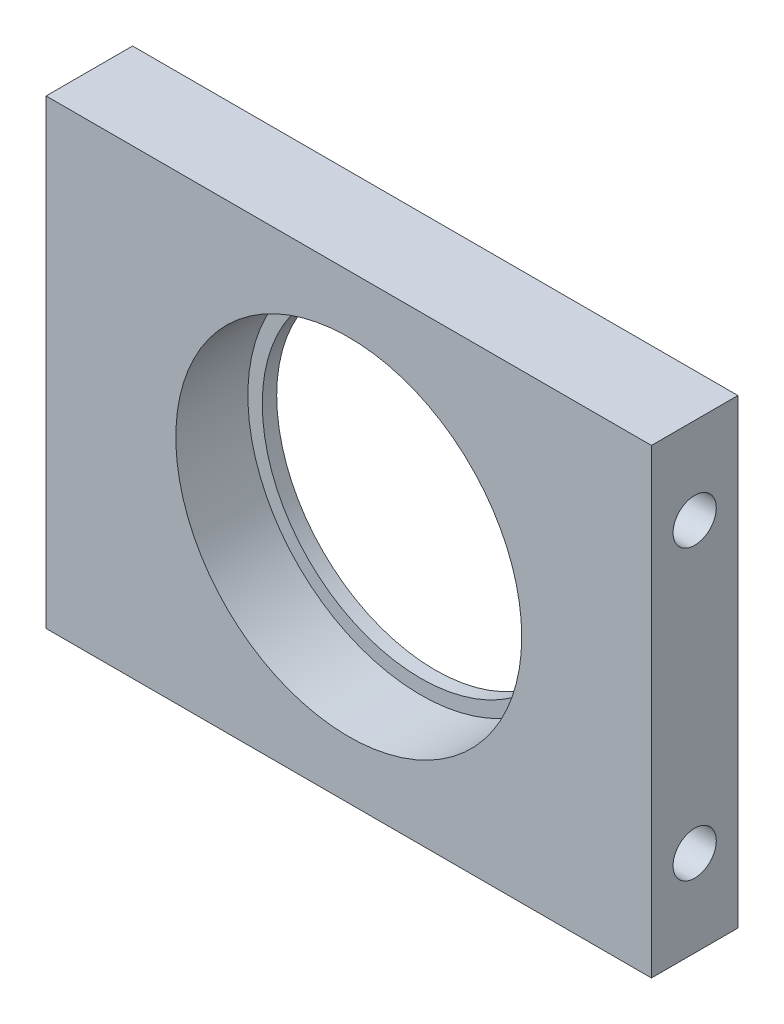
ISO-10303-21;
HEADER;
FILE_DESCRIPTION(('STEP AP214'),'2;1');
FILE_NAME('part.step','',(''),(''),'','','');
FILE_SCHEMA(('AUTOMOTIVE_DESIGN { 1 0 10303 214 1 1 1 1 }'));
ENDSEC;
DATA;
#1=APPLICATION_CONTEXT('core data for automotive mechanical design processes');
#2=APPLICATION_PROTOCOL_DEFINITION('international standard','automotive_design',2000,#1);
#3=PRODUCT_CONTEXT('',#1,'mechanical');
#4=PRODUCT('Part','Part','',(#3));
#5=PRODUCT_RELATED_PRODUCT_CATEGORY('part','',(#4));
#6=PRODUCT_DEFINITION_FORMATION('','',#4);
#7=PRODUCT_DEFINITION_CONTEXT('part definition',#1,'design');
#8=PRODUCT_DEFINITION('design','',#6,#7);
#9=PRODUCT_DEFINITION_SHAPE('','',#8);
#10=(LENGTH_UNIT() NAMED_UNIT(*) SI_UNIT(.MILLI.,.METRE.));
#11=(NAMED_UNIT(*) PLANE_ANGLE_UNIT() SI_UNIT($,.RADIAN.));
#12=(NAMED_UNIT(*) SI_UNIT($,.STERADIAN.) SOLID_ANGLE_UNIT());
#13=UNCERTAINTY_MEASURE_WITH_UNIT(LENGTH_MEASURE(1.E-05),#10,'distance_accuracy_value','');
#14=(GEOMETRIC_REPRESENTATION_CONTEXT(3) GLOBAL_UNCERTAINTY_ASSIGNED_CONTEXT((#13)) GLOBAL_UNIT_ASSIGNED_CONTEXT((#10,
#11,#12)) REPRESENTATION_CONTEXT('',''));
#15=CARTESIAN_POINT('',(0.,0.,0.));
#16=DIRECTION('',(0.,0.,1.));
#17=DIRECTION('',(1.,0.,0.));
#18=AXIS2_PLACEMENT_3D('',#15,#16,#17);
#19=CARTESIAN_POINT('',(0.,0.,6.));
#20=DIRECTION('',(0.,0.,1.));
#21=DIRECTION('',(1.,0.,0.));
#22=AXIS2_PLACEMENT_3D('',#19,#20,#21);
#23=CYLINDRICAL_SURFACE('',#22,11.);
#24=CARTESIAN_POINT('',(0.,0.,0.));
#25=DIRECTION('',(0.,0.,1.));
#26=DIRECTION('',(1.,0.,0.));
#27=AXIS2_PLACEMENT_3D('',#24,#25,#26);
#28=CIRCLE('',#27,11.);
#29=CARTESIAN_POINT('',(11.,0.,0.));
#30=VERTEX_POINT('',#29);
#31=EDGE_CURVE('E178',#30,#30,#28,.T.);
#32=ORIENTED_EDGE('',*,*,#31,.F.);
#33=EDGE_LOOP('',(#32));
#34=FACE_BOUND('',#33,.T.);
#35=CARTESIAN_POINT('',(0.,0.,1.));
#36=DIRECTION('',(0.,0.,1.));
#37=DIRECTION('',(1.,0.,0.));
#38=AXIS2_PLACEMENT_3D('',#35,#36,#37);
#39=CIRCLE('',#38,11.);
#40=CARTESIAN_POINT('',(11.,0.,1.));
#41=VERTEX_POINT('',#40);
#42=EDGE_CURVE('E38',#41,#41,#39,.F.);
#43=ORIENTED_EDGE('',*,*,#42,.F.);
#44=EDGE_LOOP('',(#43));
#45=FACE_BOUND('',#44,.T.);
#46=ADVANCED_FACE('F34',(#34,#45),#23,.F.);
#47=CARTESIAN_POINT('',(21.,16.,0.));
#48=DIRECTION('',(0.,1.,0.));
#49=DIRECTION('',(0.,0.,1.));
#50=AXIS2_PLACEMENT_3D('',#47,#48,#49);
#51=PLANE('',#50);
#52=DIRECTION('',(-1.,0.,0.));
#53=VECTOR('',#52,1.);
#54=CARTESIAN_POINT('',(21.,16.,6.));
#55=LINE('',#54,#53);
#56=CARTESIAN_POINT('',(21.,16.,6.));
#57=VERTEX_POINT('',#56);
#58=CARTESIAN_POINT('',(-21.,16.,6.));
#59=VERTEX_POINT('',#58);
#60=EDGE_CURVE('E102',#57,#59,#55,.T.);
#61=ORIENTED_EDGE('',*,*,#60,.F.);
#62=DIRECTION('',(0.,0.,1.));
#63=VECTOR('',#62,1.);
#64=CARTESIAN_POINT('',(21.,16.,0.));
#65=LINE('',#64,#63);
#66=CARTESIAN_POINT('',(21.,16.,0.));
#67=VERTEX_POINT('',#66);
#68=EDGE_CURVE('E11',#67,#57,#65,.T.);
#69=ORIENTED_EDGE('',*,*,#68,.F.);
#70=DIRECTION('',(-1.,0.,0.));
#71=VECTOR('',#70,1.);
#72=CARTESIAN_POINT('',(21.,16.,0.));
#73=LINE('',#72,#71);
#74=CARTESIAN_POINT('',(-21.,16.,0.));
#75=VERTEX_POINT('',#74);
#76=EDGE_CURVE('E95',#67,#75,#73,.T.);
#77=ORIENTED_EDGE('',*,*,#76,.T.);
#78=DIRECTION('',(0.,0.,1.));
#79=VECTOR('',#78,1.);
#80=CARTESIAN_POINT('',(-21.,16.,0.));
#81=LINE('',#80,#79);
#82=EDGE_CURVE('E78',#75,#59,#81,.T.);
#83=ORIENTED_EDGE('',*,*,#82,.T.);
#84=EDGE_LOOP('',(#61,#69,#77,#83));
#85=FACE_BOUND('',#84,.T.);
#86=ADVANCED_FACE('F36',(#85),#51,.T.);
#87=CARTESIAN_POINT('',(21.,-16.,0.));
#88=DIRECTION('',(1.,0.,0.));
#89=DIRECTION('',(0.,1.,0.));
#90=AXIS2_PLACEMENT_3D('',#87,#88,#89);
#91=PLANE('',#90);
#92=CARTESIAN_POINT('',(21.,-10.,2.99999999999989));
#93=DIRECTION('',(1.,0.,0.));
#94=DIRECTION('',(0.,0.,-1.));
#95=AXIS2_PLACEMENT_3D('',#92,#93,#94);
#96=CIRCLE('',#95,1.49999999999999);
#97=CARTESIAN_POINT('',(21.,-10.,1.4999999999999));
#98=VERTEX_POINT('',#97);
#99=EDGE_CURVE('E198',#98,#98,#96,.T.);
#100=ORIENTED_EDGE('',*,*,#99,.F.);
#101=EDGE_LOOP('',(#100));
#102=FACE_BOUND('',#101,.T.);
#103=CARTESIAN_POINT('',(21.,9.99999999999999,2.99999999999989));
#104=DIRECTION('',(1.,0.,0.));
#105=DIRECTION('',(0.,0.,-1.));
#106=AXIS2_PLACEMENT_3D('',#103,#104,#105);
#107=CIRCLE('',#106,1.49999999999999);
#108=CARTESIAN_POINT('',(21.,9.99999999999999,1.4999999999999));
#109=VERTEX_POINT('',#108);
#110=EDGE_CURVE('E204',#109,#109,#107,.T.);
#111=ORIENTED_EDGE('',*,*,#110,.F.);
#112=EDGE_LOOP('',(#111));
#113=FACE_BOUND('',#112,.T.);
#114=DIRECTION('',(0.,1.,0.));
#115=VECTOR('',#114,1.);
#116=CARTESIAN_POINT('',(21.,-16.,6.));
#117=LINE('',#116,#115);
#118=CARTESIAN_POINT('',(21.,-16.,6.));
#119=VERTEX_POINT('',#118);
#120=EDGE_CURVE('E97',#119,#57,#117,.T.);
#121=ORIENTED_EDGE('',*,*,#120,.F.);
#122=DIRECTION('',(0.,0.,1.));
#123=VECTOR('',#122,1.);
#124=CARTESIAN_POINT('',(21.,-16.,0.));
#125=LINE('',#124,#123);
#126=CARTESIAN_POINT('',(21.,-16.,0.));
#127=VERTEX_POINT('',#126);
#128=EDGE_CURVE('E44',#127,#119,#125,.T.);
#129=ORIENTED_EDGE('',*,*,#128,.F.);
#130=DIRECTION('',(0.,1.,0.));
#131=VECTOR('',#130,1.);
#132=CARTESIAN_POINT('',(21.,-16.,0.));
#133=LINE('',#132,#131);
#134=EDGE_CURVE('E92',#127,#67,#133,.T.);
#135=ORIENTED_EDGE('',*,*,#134,.T.);
#136=ORIENTED_EDGE('',*,*,#68,.T.);
#137=EDGE_LOOP('',(#121,#129,#135,#136));
#138=FACE_BOUND('',#137,.T.);
#139=ADVANCED_FACE('F113',(#102,#113,#138),#91,.T.);
#140=CARTESIAN_POINT('',(-21.,-16.,0.));
#141=DIRECTION('',(0.,-1.,0.));
#142=DIRECTION('',(0.,0.,-1.));
#143=AXIS2_PLACEMENT_3D('',#140,#141,#142);
#144=PLANE('',#143);
#145=DIRECTION('',(1.,0.,0.));
#146=VECTOR('',#145,1.);
#147=CARTESIAN_POINT('',(-21.,-16.,6.));
#148=LINE('',#147,#146);
#149=CARTESIAN_POINT('',(-21.,-16.,6.));
#150=VERTEX_POINT('',#149);
#151=EDGE_CURVE('E86',#150,#119,#148,.T.);
#152=ORIENTED_EDGE('',*,*,#151,.F.);
#153=DIRECTION('',(0.,0.,1.));
#154=VECTOR('',#153,1.);
#155=CARTESIAN_POINT('',(-21.,-16.,0.));
#156=LINE('',#155,#154);
#157=CARTESIAN_POINT('',(-21.,-16.,0.));
#158=VERTEX_POINT('',#157);
#159=EDGE_CURVE('E81',#158,#150,#156,.T.);
#160=ORIENTED_EDGE('',*,*,#159,.F.);
#161=DIRECTION('',(1.,0.,0.));
#162=VECTOR('',#161,1.);
#163=CARTESIAN_POINT('',(-21.,-16.,0.));
#164=LINE('',#163,#162);
#165=EDGE_CURVE('E84',#158,#127,#164,.T.);
#166=ORIENTED_EDGE('',*,*,#165,.T.);
#167=ORIENTED_EDGE('',*,*,#128,.T.);
#168=EDGE_LOOP('',(#152,#160,#166,#167));
#169=FACE_BOUND('',#168,.T.);
#170=ADVANCED_FACE('F83',(#169),#144,.T.);
#171=CARTESIAN_POINT('',(-21.,16.,0.));
#172=DIRECTION('',(-1.,0.,0.));
#173=DIRECTION('',(0.,-1.,0.));
#174=AXIS2_PLACEMENT_3D('',#171,#172,#173);
#175=PLANE('',#174);
#176=CARTESIAN_POINT('',(-21.,-10.,2.99999999999989));
#177=DIRECTION('',(-1.,0.,0.));
#178=DIRECTION('',(0.,0.,1.));
#179=AXIS2_PLACEMENT_3D('',#176,#177,#178);
#180=CIRCLE('',#179,1.49999999999999);
#181=CARTESIAN_POINT('',(-21.,-10.,4.49999999999988));
#182=VERTEX_POINT('',#181);
#183=EDGE_CURVE('E181',#182,#182,#180,.T.);
#184=ORIENTED_EDGE('',*,*,#183,.F.);
#185=EDGE_LOOP('',(#184));
#186=FACE_BOUND('',#185,.T.);
#187=CARTESIAN_POINT('',(-21.,9.99999999999999,2.99999999999989));
#188=DIRECTION('',(-1.,0.,0.));
#189=DIRECTION('',(0.,0.,1.));
#190=AXIS2_PLACEMENT_3D('',#187,#188,#189);
#191=CIRCLE('',#190,1.49999999999999);
#192=CARTESIAN_POINT('',(-21.,9.99999999999999,4.49999999999988));
#193=VERTEX_POINT('',#192);
#194=EDGE_CURVE('E192',#193,#193,#191,.T.);
#195=ORIENTED_EDGE('',*,*,#194,.F.);
#196=EDGE_LOOP('',(#195));
#197=FACE_BOUND('',#196,.T.);
#198=DIRECTION('',(0.,-1.,0.));
#199=VECTOR('',#198,1.);
#200=CARTESIAN_POINT('',(-21.,16.,6.));
#201=LINE('',#200,#199);
#202=EDGE_CURVE('E105',#59,#150,#201,.T.);
#203=ORIENTED_EDGE('',*,*,#202,.F.);
#204=ORIENTED_EDGE('',*,*,#82,.F.);
#205=DIRECTION('',(0.,-1.,0.));
#206=VECTOR('',#205,1.);
#207=CARTESIAN_POINT('',(-21.,16.,0.));
#208=LINE('',#207,#206);
#209=EDGE_CURVE('E91',#75,#158,#208,.T.);
#210=ORIENTED_EDGE('',*,*,#209,.T.);
#211=ORIENTED_EDGE('',*,*,#159,.T.);
#212=EDGE_LOOP('',(#203,#204,#210,#211));
#213=FACE_BOUND('',#212,.T.);
#214=ADVANCED_FACE('F94',(#186,#197,#213),#175,.T.);
#215=CARTESIAN_POINT('',(0.,0.,0.));
#216=DIRECTION('',(0.,0.,1.));
#217=DIRECTION('',(1.,0.,0.));
#218=AXIS2_PLACEMENT_3D('',#215,#216,#217);
#219=PLANE('',#218);
#220=ORIENTED_EDGE('',*,*,#31,.T.);
#221=EDGE_LOOP('',(#220));
#222=FACE_BOUND('',#221,.T.);
#223=ORIENTED_EDGE('',*,*,#76,.F.);
#224=ORIENTED_EDGE('',*,*,#134,.F.);
#225=ORIENTED_EDGE('',*,*,#165,.F.);
#226=ORIENTED_EDGE('',*,*,#209,.F.);
#227=EDGE_LOOP('',(#223,#224,#225,#226));
#228=FACE_BOUND('',#227,.T.);
#229=ADVANCED_FACE('F90',(#222,#228),#219,.F.);
#230=CARTESIAN_POINT('',(0.,0.,6.));
#231=DIRECTION('',(0.,0.,1.));
#232=DIRECTION('',(1.,0.,0.));
#233=AXIS2_PLACEMENT_3D('',#230,#231,#232);
#234=PLANE('',#233);
#235=CARTESIAN_POINT('',(0.,0.,6.));
#236=DIRECTION('',(0.,0.,1.));
#237=DIRECTION('',(1.,0.,0.));
#238=AXIS2_PLACEMENT_3D('',#235,#236,#237);
#239=CIRCLE('',#238,12.);
#240=CARTESIAN_POINT('',(12.,0.,6.));
#241=VERTEX_POINT('',#240);
#242=EDGE_CURVE('E176',#241,#241,#239,.T.);
#243=ORIENTED_EDGE('',*,*,#242,.F.);
#244=EDGE_LOOP('',(#243));
#245=FACE_BOUND('',#244,.T.);
#246=ORIENTED_EDGE('',*,*,#60,.T.);
#247=ORIENTED_EDGE('',*,*,#202,.T.);
#248=ORIENTED_EDGE('',*,*,#151,.T.);
#249=ORIENTED_EDGE('',*,*,#120,.T.);
#250=EDGE_LOOP('',(#246,#247,#248,#249));
#251=FACE_BOUND('',#250,.T.);
#252=ADVANCED_FACE('F112',(#245,#251),#234,.T.);
#253=CARTESIAN_POINT('',(15.,9.99999999999999,2.99999999999989));
#254=DIRECTION('',(-1.,0.,0.));
#255=DIRECTION('',(0.,0.,1.));
#256=AXIS2_PLACEMENT_3D('',#253,#254,#255);
#257=PLANE('',#256);
#258=CARTESIAN_POINT('',(15.,9.99999999999999,2.99999999999989));
#259=DIRECTION('',(1.,0.,0.));
#260=DIRECTION('',(0.,0.,-1.));
#261=AXIS2_PLACEMENT_3D('',#258,#259,#260);
#262=CIRCLE('',#261,1.49999999999999);
#263=CARTESIAN_POINT('',(15.,9.99999999999999,1.4999999999999));
#264=VERTEX_POINT('',#263);
#265=EDGE_CURVE('E106',#264,#264,#262,.T.);
#266=ORIENTED_EDGE('',*,*,#265,.T.);
#267=EDGE_LOOP('',(#266));
#268=FACE_BOUND('',#267,.T.);
#269=ADVANCED_FACE('F163',(#268),#257,.F.);
#270=CARTESIAN_POINT('',(21.,9.99999999999999,2.99999999999989));
#271=DIRECTION('',(1.,0.,0.));
#272=DIRECTION('',(0.,0.,-1.));
#273=AXIS2_PLACEMENT_3D('',#270,#271,#272);
#274=CYLINDRICAL_SURFACE('',#273,1.49999999999999);
#275=ORIENTED_EDGE('',*,*,#265,.F.);
#276=EDGE_LOOP('',(#275));
#277=FACE_BOUND('',#276,.T.);
#278=ORIENTED_EDGE('',*,*,#110,.T.);
#279=EDGE_LOOP('',(#278));
#280=FACE_BOUND('',#279,.T.);
#281=ADVANCED_FACE('F159',(#277,#280),#274,.F.);
#282=CARTESIAN_POINT('',(15.,-10.,2.99999999999989));
#283=DIRECTION('',(-1.,0.,0.));
#284=DIRECTION('',(0.,0.,1.));
#285=AXIS2_PLACEMENT_3D('',#282,#283,#284);
#286=PLANE('',#285);
#287=CARTESIAN_POINT('',(15.,-10.,2.99999999999989));
#288=DIRECTION('',(1.,0.,0.));
#289=DIRECTION('',(0.,0.,-1.));
#290=AXIS2_PLACEMENT_3D('',#287,#288,#289);
#291=CIRCLE('',#290,1.49999999999999);
#292=CARTESIAN_POINT('',(15.,-10.,1.4999999999999));
#293=VERTEX_POINT('',#292);
#294=EDGE_CURVE('E201',#293,#293,#291,.T.);
#295=ORIENTED_EDGE('',*,*,#294,.T.);
#296=EDGE_LOOP('',(#295));
#297=FACE_BOUND('',#296,.T.);
#298=ADVANCED_FACE('F155',(#297),#286,.F.);
#299=CARTESIAN_POINT('',(21.,-10.,2.99999999999989));
#300=DIRECTION('',(1.,0.,0.));
#301=DIRECTION('',(0.,0.,-1.));
#302=AXIS2_PLACEMENT_3D('',#299,#300,#301);
#303=CYLINDRICAL_SURFACE('',#302,1.49999999999999);
#304=ORIENTED_EDGE('',*,*,#294,.F.);
#305=EDGE_LOOP('',(#304));
#306=FACE_BOUND('',#305,.T.);
#307=ORIENTED_EDGE('',*,*,#99,.T.);
#308=EDGE_LOOP('',(#307));
#309=FACE_BOUND('',#308,.T.);
#310=ADVANCED_FACE('F151',(#306,#309),#303,.F.);
#311=CARTESIAN_POINT('',(-15.,9.99999999999999,2.99999999999989));
#312=DIRECTION('',(1.,0.,0.));
#313=DIRECTION('',(0.,0.,-1.));
#314=AXIS2_PLACEMENT_3D('',#311,#312,#313);
#315=PLANE('',#314);
#316=CARTESIAN_POINT('',(-15.,9.99999999999999,2.99999999999989));
#317=DIRECTION('',(-1.,0.,0.));
#318=DIRECTION('',(0.,0.,1.));
#319=AXIS2_PLACEMENT_3D('',#316,#317,#318);
#320=CIRCLE('',#319,1.49999999999999);
#321=CARTESIAN_POINT('',(-15.,9.99999999999999,4.49999999999988));
#322=VERTEX_POINT('',#321);
#323=EDGE_CURVE('E195',#322,#322,#320,.T.);
#324=ORIENTED_EDGE('',*,*,#323,.T.);
#325=EDGE_LOOP('',(#324));
#326=FACE_BOUND('',#325,.T.);
#327=ADVANCED_FACE('F147',(#326),#315,.F.);
#328=CARTESIAN_POINT('',(-21.,9.99999999999999,2.99999999999989));
#329=DIRECTION('',(-1.,0.,0.));
#330=DIRECTION('',(0.,0.,1.));
#331=AXIS2_PLACEMENT_3D('',#328,#329,#330);
#332=CYLINDRICAL_SURFACE('',#331,1.49999999999999);
#333=ORIENTED_EDGE('',*,*,#323,.F.);
#334=EDGE_LOOP('',(#333));
#335=FACE_BOUND('',#334,.T.);
#336=ORIENTED_EDGE('',*,*,#194,.T.);
#337=EDGE_LOOP('',(#336));
#338=FACE_BOUND('',#337,.T.);
#339=ADVANCED_FACE('F143',(#335,#338),#332,.F.);
#340=CARTESIAN_POINT('',(-15.,-10.,2.99999999999989));
#341=DIRECTION('',(1.,0.,0.));
#342=DIRECTION('',(0.,0.,-1.));
#343=AXIS2_PLACEMENT_3D('',#340,#341,#342);
#344=PLANE('',#343);
#345=CARTESIAN_POINT('',(-15.,-10.,2.99999999999989));
#346=DIRECTION('',(-1.,0.,0.));
#347=DIRECTION('',(0.,0.,1.));
#348=AXIS2_PLACEMENT_3D('',#345,#346,#347);
#349=CIRCLE('',#348,1.49999999999999);
#350=CARTESIAN_POINT('',(-15.,-10.,4.49999999999988));
#351=VERTEX_POINT('',#350);
#352=EDGE_CURVE('E189',#351,#351,#349,.T.);
#353=ORIENTED_EDGE('',*,*,#352,.T.);
#354=EDGE_LOOP('',(#353));
#355=FACE_BOUND('',#354,.T.);
#356=ADVANCED_FACE('F139',(#355),#344,.F.);
#357=CARTESIAN_POINT('',(-21.,-10.,2.99999999999989));
#358=DIRECTION('',(-1.,0.,0.));
#359=DIRECTION('',(0.,0.,1.));
#360=AXIS2_PLACEMENT_3D('',#357,#358,#359);
#361=CYLINDRICAL_SURFACE('',#360,1.49999999999999);
#362=ORIENTED_EDGE('',*,*,#352,.F.);
#363=EDGE_LOOP('',(#362));
#364=FACE_BOUND('',#363,.T.);
#365=ORIENTED_EDGE('',*,*,#183,.T.);
#366=EDGE_LOOP('',(#365));
#367=FACE_BOUND('',#366,.T.);
#368=ADVANCED_FACE('F136',(#364,#367),#361,.F.);
#369=CARTESIAN_POINT('',(0.,0.,6.));
#370=DIRECTION('',(0.,0.,1.));
#371=DIRECTION('',(1.,0.,0.));
#372=AXIS2_PLACEMENT_3D('',#369,#370,#371);
#373=CYLINDRICAL_SURFACE('',#372,12.);
#374=ORIENTED_EDGE('',*,*,#242,.T.);
#375=EDGE_LOOP('',(#374));
#376=FACE_BOUND('',#375,.T.);
#377=CARTESIAN_POINT('',(0.,0.,1.));
#378=DIRECTION('',(0.,0.,1.));
#379=DIRECTION('',(1.,0.,0.));
#380=AXIS2_PLACEMENT_3D('',#377,#378,#379);
#381=CIRCLE('',#380,12.);
#382=CARTESIAN_POINT('',(12.,0.,1.));
#383=VERTEX_POINT('',#382);
#384=EDGE_CURVE('E184',#383,#383,#381,.T.);
#385=ORIENTED_EDGE('',*,*,#384,.F.);
#386=EDGE_LOOP('',(#385));
#387=FACE_BOUND('',#386,.T.);
#388=ADVANCED_FACE('F134',(#376,#387),#373,.F.);
#389=CARTESIAN_POINT('',(0.,0.,1.));
#390=DIRECTION('',(0.,0.,1.));
#391=DIRECTION('',(1.,0.,0.));
#392=AXIS2_PLACEMENT_3D('',#389,#390,#391);
#393=PLANE('',#392);
#394=ORIENTED_EDGE('',*,*,#384,.T.);
#395=EDGE_LOOP('',(#394));
#396=FACE_BOUND('',#395,.T.);
#397=ORIENTED_EDGE('',*,*,#42,.T.);
#398=EDGE_LOOP('',(#397));
#399=FACE_BOUND('',#398,.T.);
#400=ADVANCED_FACE('F253',(#396,#399),#393,.T.);
#401=CLOSED_SHELL('',(#46,#86,#139,#170,#214,#229,#252,#269,#281,#298,#310,#327,#339,#356,#368,
#388,#400));
#402=MANIFOLD_SOLID_BREP('B2',#401);
#403=ADVANCED_BREP_SHAPE_REPRESENTATION('',(#18,#402),#14);
#404=SHAPE_DEFINITION_REPRESENTATION(#9,#403);
ENDSEC;
END-ISO-10303-21;
